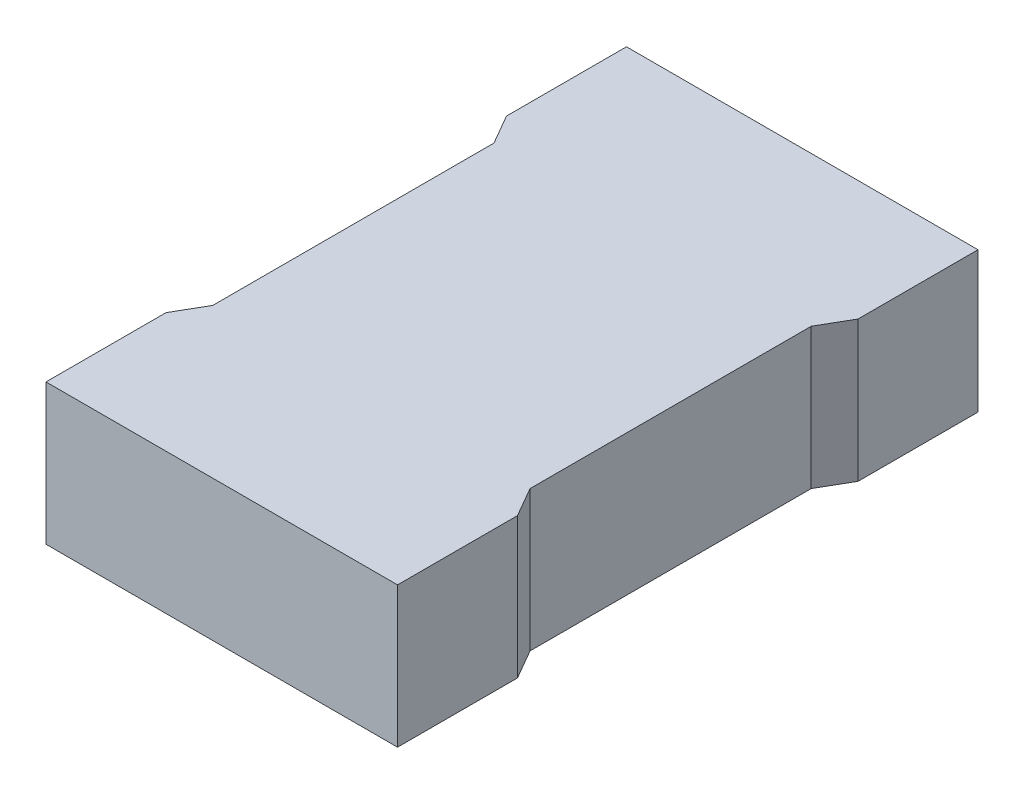
ISO-10303-21;
HEADER;
FILE_DESCRIPTION(('STEP AP214'),'2;1');
FILE_NAME('part.step','',(''),(''),'','','');
FILE_SCHEMA(('AUTOMOTIVE_DESIGN { 1 0 10303 214 1 1 1 1 }'));
ENDSEC;
DATA;
#1=APPLICATION_CONTEXT('core data for automotive mechanical design processes');
#2=APPLICATION_PROTOCOL_DEFINITION('international standard','automotive_design',2000,#1);
#3=PRODUCT_CONTEXT('',#1,'mechanical');
#4=PRODUCT('Part','Part','',(#3));
#5=PRODUCT_RELATED_PRODUCT_CATEGORY('part','',(#4));
#6=PRODUCT_DEFINITION_FORMATION('','',#4);
#7=PRODUCT_DEFINITION_CONTEXT('part definition',#1,'design');
#8=PRODUCT_DEFINITION('design','',#6,#7);
#9=PRODUCT_DEFINITION_SHAPE('','',#8);
#10=(LENGTH_UNIT() NAMED_UNIT(*) SI_UNIT(.MILLI.,.METRE.));
#11=(NAMED_UNIT(*) PLANE_ANGLE_UNIT() SI_UNIT($,.RADIAN.));
#12=(NAMED_UNIT(*) SI_UNIT($,.STERADIAN.) SOLID_ANGLE_UNIT());
#13=UNCERTAINTY_MEASURE_WITH_UNIT(LENGTH_MEASURE(1.E-05),#10,'distance_accuracy_value','');
#14=(GEOMETRIC_REPRESENTATION_CONTEXT(3) GLOBAL_UNCERTAINTY_ASSIGNED_CONTEXT((#13)) GLOBAL_UNIT_ASSIGNED_CONTEXT((#10,
#11,#12)) REPRESENTATION_CONTEXT('',''));
#15=CARTESIAN_POINT('',(0.,0.,0.));
#16=DIRECTION('',(0.,0.,1.));
#17=DIRECTION('',(1.,0.,0.));
#18=AXIS2_PLACEMENT_3D('',#15,#16,#17);
#19=CARTESIAN_POINT('',(-24.765,19.812,-23.9914385986636));
#20=DIRECTION('',(1.,0.,0.));
#21=DIRECTION('',(0.,0.,-1.));
#22=AXIS2_PLACEMENT_3D('',#19,#20,#21);
#23=PLANE('',#22);
#24=DIRECTION('',(0.,0.,1.));
#25=VECTOR('',#24,1.);
#26=CARTESIAN_POINT('',(-24.765,0.,-23.9914385986636));
#27=LINE('',#26,#25);
#28=CARTESIAN_POINT('',(-24.765,0.,-40.894));
#29=VERTEX_POINT('',#28);
#30=CARTESIAN_POINT('',(-24.765,0.,-23.9914385986636));
#31=VERTEX_POINT('',#30);
#32=EDGE_CURVE('E171',#29,#31,#27,.T.);
#33=ORIENTED_EDGE('',*,*,#32,.T.);
#34=DIRECTION('',(0.,-1.,0.));
#35=VECTOR('',#34,1.);
#36=CARTESIAN_POINT('',(-24.765,19.812,-23.9914385986636));
#37=LINE('',#36,#35);
#38=CARTESIAN_POINT('',(-24.765,19.812,-23.9914385986636));
#39=VERTEX_POINT('',#38);
#40=EDGE_CURVE('E11',#39,#31,#37,.T.);
#41=ORIENTED_EDGE('',*,*,#40,.F.);
#42=DIRECTION('',(0.,0.,1.));
#43=VECTOR('',#42,1.);
#44=CARTESIAN_POINT('',(-24.765,19.812,-23.9914385986636));
#45=LINE('',#44,#43);
#46=CARTESIAN_POINT('',(-24.765,19.812,-40.894));
#47=VERTEX_POINT('',#46);
#48=EDGE_CURVE('E205',#47,#39,#45,.T.);
#49=ORIENTED_EDGE('',*,*,#48,.F.);
#50=DIRECTION('',(0.,-1.,0.));
#51=VECTOR('',#50,1.);
#52=CARTESIAN_POINT('',(-24.765,19.812,-40.894));
#53=LINE('',#52,#51);
#54=EDGE_CURVE('E167',#47,#29,#53,.T.);
#55=ORIENTED_EDGE('',*,*,#54,.T.);
#56=EDGE_LOOP('',(#33,#41,#49,#55));
#57=FACE_BOUND('',#56,.T.);
#58=ADVANCED_FACE('F46',(#57),#23,.F.);
#59=CARTESIAN_POINT('',(-24.765,19.812,-23.9914385986636));
#60=DIRECTION('',(0.866025403784438,0.,-0.500000000000001));
#61=DIRECTION('',(-0.500000000000001,0.,-0.866025403784438));
#62=AXIS2_PLACEMENT_3D('',#59,#60,#61);
#63=PLANE('',#62);
#64=DIRECTION('',(0.500000000000001,0.,0.866025403784438));
#65=VECTOR('',#64,1.);
#66=CARTESIAN_POINT('',(-24.765,0.,-23.9914385986636));
#67=LINE('',#66,#65);
#68=CARTESIAN_POINT('',(-22.352,0.,-19.812));
#69=VERTEX_POINT('',#68);
#70=EDGE_CURVE('E175',#31,#69,#67,.T.);
#71=ORIENTED_EDGE('',*,*,#70,.T.);
#72=DIRECTION('',(0.,-1.,0.));
#73=VECTOR('',#72,1.);
#74=CARTESIAN_POINT('',(-22.352,19.812,-19.812));
#75=LINE('',#74,#73);
#76=CARTESIAN_POINT('',(-22.352,19.812,-19.812));
#77=VERTEX_POINT('',#76);
#78=EDGE_CURVE('E55',#77,#69,#75,.T.);
#79=ORIENTED_EDGE('',*,*,#78,.F.);
#80=DIRECTION('',(0.500000000000001,0.,0.866025403784438));
#81=VECTOR('',#80,1.);
#82=CARTESIAN_POINT('',(-24.765,19.812,-23.9914385986636));
#83=LINE('',#82,#81);
#84=EDGE_CURVE('E118',#39,#77,#83,.T.);
#85=ORIENTED_EDGE('',*,*,#84,.F.);
#86=ORIENTED_EDGE('',*,*,#40,.T.);
#87=EDGE_LOOP('',(#71,#79,#85,#86));
#88=FACE_BOUND('',#87,.T.);
#89=ADVANCED_FACE('F300',(#88),#63,.F.);
#90=CARTESIAN_POINT('',(-22.352,19.812,-19.812));
#91=DIRECTION('',(1.,0.,0.));
#92=DIRECTION('',(0.,0.,-1.));
#93=AXIS2_PLACEMENT_3D('',#90,#91,#92);
#94=PLANE('',#93);
#95=DIRECTION('',(0.,0.,1.));
#96=VECTOR('',#95,1.);
#97=CARTESIAN_POINT('',(-22.352,0.,-19.812));
#98=LINE('',#97,#96);
#99=CARTESIAN_POINT('',(-22.352,0.,19.812));
#100=VERTEX_POINT('',#99);
#101=EDGE_CURVE('E178',#69,#100,#98,.T.);
#102=ORIENTED_EDGE('',*,*,#101,.T.);
#103=DIRECTION('',(0.,-1.,0.));
#104=VECTOR('',#103,1.);
#105=CARTESIAN_POINT('',(-22.352,19.812,19.812));
#106=LINE('',#105,#104);
#107=CARTESIAN_POINT('',(-22.352,19.812,19.812));
#108=VERTEX_POINT('',#107);
#109=EDGE_CURVE('E232',#108,#100,#106,.T.);
#110=ORIENTED_EDGE('',*,*,#109,.F.);
#111=DIRECTION('',(0.,0.,1.));
#112=VECTOR('',#111,1.);
#113=CARTESIAN_POINT('',(-22.352,19.812,-19.812));
#114=LINE('',#113,#112);
#115=EDGE_CURVE('E242',#77,#108,#114,.T.);
#116=ORIENTED_EDGE('',*,*,#115,.F.);
#117=ORIENTED_EDGE('',*,*,#78,.T.);
#118=EDGE_LOOP('',(#102,#110,#116,#117));
#119=FACE_BOUND('',#118,.T.);
#120=ADVANCED_FACE('F240',(#119),#94,.F.);
#121=CARTESIAN_POINT('',(-24.765,19.812,23.9914385986636));
#122=DIRECTION('',(0.866025403784438,0.,0.500000000000001));
#123=DIRECTION('',(0.500000000000001,0.,-0.866025403784438));
#124=AXIS2_PLACEMENT_3D('',#121,#122,#123);
#125=PLANE('',#124);
#126=DIRECTION('',(-0.500000000000001,0.,0.866025403784438));
#127=VECTOR('',#126,1.);
#128=CARTESIAN_POINT('',(-24.765,0.,23.9914385986636));
#129=LINE('',#128,#127);
#130=CARTESIAN_POINT('',(-24.765,0.,23.9914385986636));
#131=VERTEX_POINT('',#130);
#132=EDGE_CURVE('E181',#100,#131,#129,.T.);
#133=ORIENTED_EDGE('',*,*,#132,.T.);
#134=DIRECTION('',(0.,-1.,0.));
#135=VECTOR('',#134,1.);
#136=CARTESIAN_POINT('',(-24.765,19.812,23.9914385986636));
#137=LINE('',#136,#135);
#138=CARTESIAN_POINT('',(-24.765,19.812,23.9914385986636));
#139=VERTEX_POINT('',#138);
#140=EDGE_CURVE('E228',#139,#131,#137,.T.);
#141=ORIENTED_EDGE('',*,*,#140,.F.);
#142=DIRECTION('',(-0.500000000000001,0.,0.866025403784438));
#143=VECTOR('',#142,1.);
#144=CARTESIAN_POINT('',(-24.765,19.812,23.9914385986636));
#145=LINE('',#144,#143);
#146=EDGE_CURVE('E261',#108,#139,#145,.T.);
#147=ORIENTED_EDGE('',*,*,#146,.F.);
#148=ORIENTED_EDGE('',*,*,#109,.T.);
#149=EDGE_LOOP('',(#133,#141,#147,#148));
#150=FACE_BOUND('',#149,.T.);
#151=ADVANCED_FACE('F251',(#150),#125,.F.);
#152=CARTESIAN_POINT('',(-24.765,19.812,40.894));
#153=DIRECTION('',(1.,0.,0.));
#154=DIRECTION('',(0.,0.,-1.));
#155=AXIS2_PLACEMENT_3D('',#152,#153,#154);
#156=PLANE('',#155);
#157=DIRECTION('',(0.,0.,1.));
#158=VECTOR('',#157,1.);
#159=CARTESIAN_POINT('',(-24.765,0.,40.894));
#160=LINE('',#159,#158);
#161=CARTESIAN_POINT('',(-24.765,0.,40.894));
#162=VERTEX_POINT('',#161);
#163=EDGE_CURVE('E184',#131,#162,#160,.T.);
#164=ORIENTED_EDGE('',*,*,#163,.T.);
#165=DIRECTION('',(0.,-1.,0.));
#166=VECTOR('',#165,1.);
#167=CARTESIAN_POINT('',(-24.765,19.812,40.894));
#168=LINE('',#167,#166);
#169=CARTESIAN_POINT('',(-24.765,19.812,40.894));
#170=VERTEX_POINT('',#169);
#171=EDGE_CURVE('E224',#170,#162,#168,.T.);
#172=ORIENTED_EDGE('',*,*,#171,.F.);
#173=DIRECTION('',(0.,0.,1.));
#174=VECTOR('',#173,1.);
#175=CARTESIAN_POINT('',(-24.765,19.812,40.894));
#176=LINE('',#175,#174);
#177=EDGE_CURVE('E257',#139,#170,#176,.T.);
#178=ORIENTED_EDGE('',*,*,#177,.F.);
#179=ORIENTED_EDGE('',*,*,#140,.T.);
#180=EDGE_LOOP('',(#164,#172,#178,#179));
#181=FACE_BOUND('',#180,.T.);
#182=ADVANCED_FACE('F255',(#181),#156,.F.);
#183=CARTESIAN_POINT('',(24.765,19.812,40.894));
#184=DIRECTION('',(0.,0.,-1.));
#185=DIRECTION('',(-1.,0.,0.));
#186=AXIS2_PLACEMENT_3D('',#183,#184,#185);
#187=PLANE('',#186);
#188=DIRECTION('',(1.,0.,0.));
#189=VECTOR('',#188,1.);
#190=CARTESIAN_POINT('',(24.765,0.,40.894));
#191=LINE('',#190,#189);
#192=CARTESIAN_POINT('',(24.765,0.,40.894));
#193=VERTEX_POINT('',#192);
#194=EDGE_CURVE('E187',#162,#193,#191,.T.);
#195=ORIENTED_EDGE('',*,*,#194,.T.);
#196=DIRECTION('',(0.,-1.,0.));
#197=VECTOR('',#196,1.);
#198=CARTESIAN_POINT('',(24.765,19.812,40.894));
#199=LINE('',#198,#197);
#200=CARTESIAN_POINT('',(24.765,19.812,40.894));
#201=VERTEX_POINT('',#200);
#202=EDGE_CURVE('E220',#201,#193,#199,.T.);
#203=ORIENTED_EDGE('',*,*,#202,.F.);
#204=DIRECTION('',(1.,0.,0.));
#205=VECTOR('',#204,1.);
#206=CARTESIAN_POINT('',(24.765,19.812,40.894));
#207=LINE('',#206,#205);
#208=EDGE_CURVE('E260',#170,#201,#207,.T.);
#209=ORIENTED_EDGE('',*,*,#208,.F.);
#210=ORIENTED_EDGE('',*,*,#171,.T.);
#211=EDGE_LOOP('',(#195,#203,#209,#210));
#212=FACE_BOUND('',#211,.T.);
#213=ADVANCED_FACE('F313',(#212),#187,.F.);
#214=CARTESIAN_POINT('',(24.765,19.812,40.894));
#215=DIRECTION('',(-1.,0.,0.));
#216=DIRECTION('',(0.,0.,1.));
#217=AXIS2_PLACEMENT_3D('',#214,#215,#216);
#218=PLANE('',#217);
#219=DIRECTION('',(0.,0.,-1.));
#220=VECTOR('',#219,1.);
#221=CARTESIAN_POINT('',(24.765,0.,40.894));
#222=LINE('',#221,#220);
#223=CARTESIAN_POINT('',(24.765,0.,23.9914385986636));
#224=VERTEX_POINT('',#223);
#225=EDGE_CURVE('E190',#193,#224,#222,.T.);
#226=ORIENTED_EDGE('',*,*,#225,.T.);
#227=DIRECTION('',(0.,-1.,0.));
#228=VECTOR('',#227,1.);
#229=CARTESIAN_POINT('',(24.765,19.812,23.9914385986636));
#230=LINE('',#229,#228);
#231=CARTESIAN_POINT('',(24.765,19.812,23.9914385986636));
#232=VERTEX_POINT('',#231);
#233=EDGE_CURVE('E216',#232,#224,#230,.T.);
#234=ORIENTED_EDGE('',*,*,#233,.F.);
#235=DIRECTION('',(0.,0.,-1.));
#236=VECTOR('',#235,1.);
#237=CARTESIAN_POINT('',(24.765,19.812,40.894));
#238=LINE('',#237,#236);
#239=EDGE_CURVE('E265',#201,#232,#238,.T.);
#240=ORIENTED_EDGE('',*,*,#239,.F.);
#241=ORIENTED_EDGE('',*,*,#202,.T.);
#242=EDGE_LOOP('',(#226,#234,#240,#241));
#243=FACE_BOUND('',#242,.T.);
#244=ADVANCED_FACE('F316',(#243),#218,.F.);
#245=CARTESIAN_POINT('',(24.765,19.812,23.9914385986636));
#246=DIRECTION('',(-0.866025403784434,0.,0.500000000000007));
#247=DIRECTION('',(0.500000000000007,0.,0.866025403784434));
#248=AXIS2_PLACEMENT_3D('',#245,#246,#247);
#249=PLANE('',#248);
#250=DIRECTION('',(-0.500000000000007,0.,-0.866025403784434));
#251=VECTOR('',#250,1.);
#252=CARTESIAN_POINT('',(24.765,0.,23.9914385986636));
#253=LINE('',#252,#251);
#254=CARTESIAN_POINT('',(22.352,0.,19.812));
#255=VERTEX_POINT('',#254);
#256=EDGE_CURVE('E193',#224,#255,#253,.T.);
#257=ORIENTED_EDGE('',*,*,#256,.T.);
#258=DIRECTION('',(0.,-1.,0.));
#259=VECTOR('',#258,1.);
#260=CARTESIAN_POINT('',(22.352,19.812,19.812));
#261=LINE('',#260,#259);
#262=CARTESIAN_POINT('',(22.352,19.812,19.812));
#263=VERTEX_POINT('',#262);
#264=EDGE_CURVE('E212',#263,#255,#261,.T.);
#265=ORIENTED_EDGE('',*,*,#264,.F.);
#266=DIRECTION('',(-0.500000000000007,0.,-0.866025403784434));
#267=VECTOR('',#266,1.);
#268=CARTESIAN_POINT('',(24.765,19.812,23.9914385986636));
#269=LINE('',#268,#267);
#270=EDGE_CURVE('E272',#232,#263,#269,.T.);
#271=ORIENTED_EDGE('',*,*,#270,.F.);
#272=ORIENTED_EDGE('',*,*,#233,.T.);
#273=EDGE_LOOP('',(#257,#265,#271,#272));
#274=FACE_BOUND('',#273,.T.);
#275=ADVANCED_FACE('F280',(#274),#249,.F.);
#276=CARTESIAN_POINT('',(22.352,19.812,-19.812));
#277=DIRECTION('',(-1.,0.,0.));
#278=DIRECTION('',(0.,0.,1.));
#279=AXIS2_PLACEMENT_3D('',#276,#277,#278);
#280=PLANE('',#279);
#281=DIRECTION('',(0.,0.,-1.));
#282=VECTOR('',#281,1.);
#283=CARTESIAN_POINT('',(22.352,0.,-19.812));
#284=LINE('',#283,#282);
#285=CARTESIAN_POINT('',(22.352,0.,-19.812));
#286=VERTEX_POINT('',#285);
#287=EDGE_CURVE('E196',#255,#286,#284,.T.);
#288=ORIENTED_EDGE('',*,*,#287,.T.);
#289=DIRECTION('',(0.,-1.,0.));
#290=VECTOR('',#289,1.);
#291=CARTESIAN_POINT('',(22.352,19.812,-19.812));
#292=LINE('',#291,#290);
#293=CARTESIAN_POINT('',(22.352,19.812,-19.812));
#294=VERTEX_POINT('',#293);
#295=EDGE_CURVE('E160',#294,#286,#292,.T.);
#296=ORIENTED_EDGE('',*,*,#295,.F.);
#297=DIRECTION('',(0.,0.,-1.));
#298=VECTOR('',#297,1.);
#299=CARTESIAN_POINT('',(22.352,19.812,-19.812));
#300=LINE('',#299,#298);
#301=EDGE_CURVE('E149',#263,#294,#300,.T.);
#302=ORIENTED_EDGE('',*,*,#301,.F.);
#303=ORIENTED_EDGE('',*,*,#264,.T.);
#304=EDGE_LOOP('',(#288,#296,#302,#303));
#305=FACE_BOUND('',#304,.T.);
#306=ADVANCED_FACE('F284',(#305),#280,.F.);
#307=CARTESIAN_POINT('',(24.765,19.812,-23.9914385986636));
#308=DIRECTION('',(-0.866025403784434,0.,-0.500000000000008));
#309=DIRECTION('',(-0.500000000000008,0.,0.866025403784434));
#310=AXIS2_PLACEMENT_3D('',#307,#308,#309);
#311=PLANE('',#310);
#312=DIRECTION('',(0.500000000000008,0.,-0.866025403784434));
#313=VECTOR('',#312,1.);
#314=CARTESIAN_POINT('',(24.765,0.,-23.9914385986636));
#315=LINE('',#314,#313);
#316=CARTESIAN_POINT('',(24.765,0.,-23.9914385986636));
#317=VERTEX_POINT('',#316);
#318=EDGE_CURVE('E158',#286,#317,#315,.T.);
#319=ORIENTED_EDGE('',*,*,#318,.T.);
#320=DIRECTION('',(0.,-1.,0.));
#321=VECTOR('',#320,1.);
#322=CARTESIAN_POINT('',(24.765,19.812,-23.9914385986636));
#323=LINE('',#322,#321);
#324=CARTESIAN_POINT('',(24.765,19.812,-23.9914385986636));
#325=VERTEX_POINT('',#324);
#326=EDGE_CURVE('E155',#325,#317,#323,.T.);
#327=ORIENTED_EDGE('',*,*,#326,.F.);
#328=DIRECTION('',(0.500000000000008,0.,-0.866025403784434));
#329=VECTOR('',#328,1.);
#330=CARTESIAN_POINT('',(24.765,19.812,-23.9914385986636));
#331=LINE('',#330,#329);
#332=EDGE_CURVE('E143',#294,#325,#331,.T.);
#333=ORIENTED_EDGE('',*,*,#332,.F.);
#334=ORIENTED_EDGE('',*,*,#295,.T.);
#335=EDGE_LOOP('',(#319,#327,#333,#334));
#336=FACE_BOUND('',#335,.T.);
#337=ADVANCED_FACE('F156',(#336),#311,.F.);
#338=CARTESIAN_POINT('',(24.765,19.812,-23.9914385986636));
#339=DIRECTION('',(-1.,0.,0.));
#340=DIRECTION('',(0.,0.,1.));
#341=AXIS2_PLACEMENT_3D('',#338,#339,#340);
#342=PLANE('',#341);
#343=DIRECTION('',(0.,0.,-1.));
#344=VECTOR('',#343,1.);
#345=CARTESIAN_POINT('',(24.765,0.,-23.9914385986636));
#346=LINE('',#345,#344);
#347=CARTESIAN_POINT('',(24.765,0.,-40.894));
#348=VERTEX_POINT('',#347);
#349=EDGE_CURVE('E104',#317,#348,#346,.T.);
#350=ORIENTED_EDGE('',*,*,#349,.T.);
#351=DIRECTION('',(0.,-1.,0.));
#352=VECTOR('',#351,1.);
#353=CARTESIAN_POINT('',(24.765,19.812,-40.894));
#354=LINE('',#353,#352);
#355=CARTESIAN_POINT('',(24.765,19.812,-40.894));
#356=VERTEX_POINT('',#355);
#357=EDGE_CURVE('E161',#356,#348,#354,.T.);
#358=ORIENTED_EDGE('',*,*,#357,.F.);
#359=DIRECTION('',(0.,0.,-1.));
#360=VECTOR('',#359,1.);
#361=CARTESIAN_POINT('',(24.765,19.812,-23.9914385986636));
#362=LINE('',#361,#360);
#363=EDGE_CURVE('E147',#325,#356,#362,.T.);
#364=ORIENTED_EDGE('',*,*,#363,.F.);
#365=ORIENTED_EDGE('',*,*,#326,.T.);
#366=EDGE_LOOP('',(#350,#358,#364,#365));
#367=FACE_BOUND('',#366,.T.);
#368=ADVANCED_FACE('F163',(#367),#342,.F.);
#369=CARTESIAN_POINT('',(24.765,19.812,-40.894));
#370=DIRECTION('',(0.,0.,1.));
#371=DIRECTION('',(1.,0.,0.));
#372=AXIS2_PLACEMENT_3D('',#369,#370,#371);
#373=PLANE('',#372);
#374=DIRECTION('',(-1.,0.,0.));
#375=VECTOR('',#374,1.);
#376=CARTESIAN_POINT('',(24.765,0.,-40.894));
#377=LINE('',#376,#375);
#378=EDGE_CURVE('E110',#348,#29,#377,.T.);
#379=ORIENTED_EDGE('',*,*,#378,.T.);
#380=ORIENTED_EDGE('',*,*,#54,.F.);
#381=DIRECTION('',(-1.,0.,0.));
#382=VECTOR('',#381,1.);
#383=CARTESIAN_POINT('',(24.765,19.812,-40.894));
#384=LINE('',#383,#382);
#385=EDGE_CURVE('E63',#356,#47,#384,.T.);
#386=ORIENTED_EDGE('',*,*,#385,.F.);
#387=ORIENTED_EDGE('',*,*,#357,.T.);
#388=EDGE_LOOP('',(#379,#380,#386,#387));
#389=FACE_BOUND('',#388,.T.);
#390=ADVANCED_FACE('F288',(#389),#373,.F.);
#391=CARTESIAN_POINT('',(0.,19.812,0.));
#392=DIRECTION('',(0.,1.,0.));
#393=DIRECTION('',(0.,0.,1.));
#394=AXIS2_PLACEMENT_3D('',#391,#392,#393);
#395=PLANE('',#394);
#396=ORIENTED_EDGE('',*,*,#48,.T.);
#397=ORIENTED_EDGE('',*,*,#84,.T.);
#398=ORIENTED_EDGE('',*,*,#115,.T.);
#399=ORIENTED_EDGE('',*,*,#146,.T.);
#400=ORIENTED_EDGE('',*,*,#177,.T.);
#401=ORIENTED_EDGE('',*,*,#208,.T.);
#402=ORIENTED_EDGE('',*,*,#239,.T.);
#403=ORIENTED_EDGE('',*,*,#270,.T.);
#404=ORIENTED_EDGE('',*,*,#301,.T.);
#405=ORIENTED_EDGE('',*,*,#332,.T.);
#406=ORIENTED_EDGE('',*,*,#363,.T.);
#407=ORIENTED_EDGE('',*,*,#385,.T.);
#408=EDGE_LOOP('',(#396,#397,#398,#399,#400,#401,#402,#403,#404,#405,#406,#407));
#409=FACE_BOUND('',#408,.T.);
#410=ADVANCED_FACE('F145',(#409),#395,.T.);
#411=CARTESIAN_POINT('',(0.,0.,0.));
#412=DIRECTION('',(0.,1.,0.));
#413=DIRECTION('',(0.,0.,1.));
#414=AXIS2_PLACEMENT_3D('',#411,#412,#413);
#415=PLANE('',#414);
#416=ORIENTED_EDGE('',*,*,#32,.F.);
#417=ORIENTED_EDGE('',*,*,#378,.F.);
#418=ORIENTED_EDGE('',*,*,#349,.F.);
#419=ORIENTED_EDGE('',*,*,#318,.F.);
#420=ORIENTED_EDGE('',*,*,#287,.F.);
#421=ORIENTED_EDGE('',*,*,#256,.F.);
#422=ORIENTED_EDGE('',*,*,#225,.F.);
#423=ORIENTED_EDGE('',*,*,#194,.F.);
#424=ORIENTED_EDGE('',*,*,#163,.F.);
#425=ORIENTED_EDGE('',*,*,#132,.F.);
#426=ORIENTED_EDGE('',*,*,#101,.F.);
#427=ORIENTED_EDGE('',*,*,#70,.F.);
#428=EDGE_LOOP('',(#416,#417,#418,#419,#420,#421,#422,#423,#424,#425,#426,#427));
#429=FACE_BOUND('',#428,.T.);
#430=ADVANCED_FACE('F246',(#429),#415,.F.);
#431=CLOSED_SHELL('',(#58,#89,#120,#151,#182,#213,#244,#275,#306,#337,#368,#390,#410,#430));
#432=MANIFOLD_SOLID_BREP('B2',#431);
#433=ADVANCED_BREP_SHAPE_REPRESENTATION('',(#18,#432),#14);
#434=SHAPE_DEFINITION_REPRESENTATION(#9,#433);
ENDSEC;
END-ISO-10303-21;
